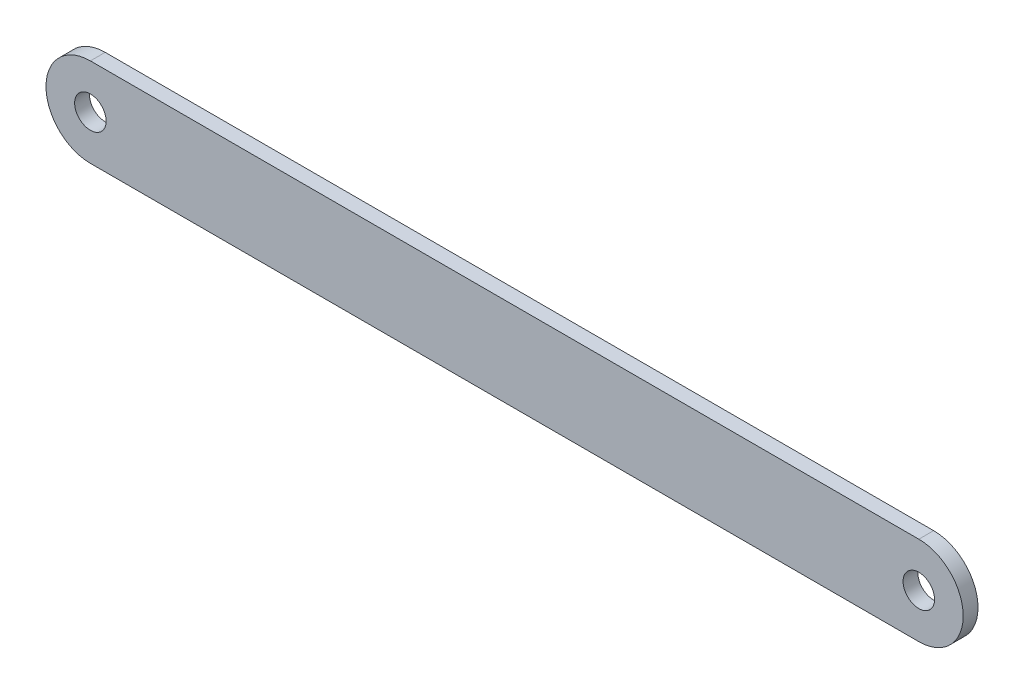
ISO-10303-21;
HEADER;
FILE_DESCRIPTION(('STEP AP214'),'2;1');
FILE_NAME('part.step','',(''),(''),'','','');
FILE_SCHEMA(('AUTOMOTIVE_DESIGN { 1 0 10303 214 1 1 1 1 }'));
ENDSEC;
DATA;
#1=APPLICATION_CONTEXT('core data for automotive mechanical design processes');
#2=APPLICATION_PROTOCOL_DEFINITION('international standard','automotive_design',2000,#1);
#3=PRODUCT_CONTEXT('',#1,'mechanical');
#4=PRODUCT('Part','Part','',(#3));
#5=PRODUCT_RELATED_PRODUCT_CATEGORY('part','',(#4));
#6=PRODUCT_DEFINITION_FORMATION('','',#4);
#7=PRODUCT_DEFINITION_CONTEXT('part definition',#1,'design');
#8=PRODUCT_DEFINITION('design','',#6,#7);
#9=PRODUCT_DEFINITION_SHAPE('','',#8);
#10=(LENGTH_UNIT() NAMED_UNIT(*) SI_UNIT(.MILLI.,.METRE.));
#11=(NAMED_UNIT(*) PLANE_ANGLE_UNIT() SI_UNIT($,.RADIAN.));
#12=(NAMED_UNIT(*) SI_UNIT($,.STERADIAN.) SOLID_ANGLE_UNIT());
#13=UNCERTAINTY_MEASURE_WITH_UNIT(LENGTH_MEASURE(1.E-05),#10,'distance_accuracy_value','');
#14=(GEOMETRIC_REPRESENTATION_CONTEXT(3) GLOBAL_UNCERTAINTY_ASSIGNED_CONTEXT((#13)) GLOBAL_UNIT_ASSIGNED_CONTEXT((#10,
#11,#12)) REPRESENTATION_CONTEXT('',''));
#15=CARTESIAN_POINT('',(0.,0.,0.));
#16=DIRECTION('',(0.,0.,1.));
#17=DIRECTION('',(1.,0.,0.));
#18=AXIS2_PLACEMENT_3D('',#15,#16,#17);
#19=CARTESIAN_POINT('',(88.9,0.,1.5875));
#20=DIRECTION('',(0.,0.,-1.));
#21=DIRECTION('',(-1.,0.,0.));
#22=AXIS2_PLACEMENT_3D('',#19,#20,#21);
#23=CYLINDRICAL_SURFACE('',#22,9.525);
#24=CARTESIAN_POINT('',(88.9,0.,-1.5875));
#25=DIRECTION('',(0.,0.,1.));
#26=DIRECTION('',(1.,0.,0.));
#27=AXIS2_PLACEMENT_3D('',#24,#25,#26);
#28=CIRCLE('',#27,9.525);
#29=CARTESIAN_POINT('',(88.9,-9.525,-1.5875));
#30=VERTEX_POINT('',#29);
#31=CARTESIAN_POINT('',(88.9,9.52500000000001,-1.5875));
#32=VERTEX_POINT('',#31);
#33=EDGE_CURVE('E98',#30,#32,#28,.T.);
#34=ORIENTED_EDGE('',*,*,#33,.T.);
#35=DIRECTION('',(0.,0.,-1.));
#36=VECTOR('',#35,1.);
#37=CARTESIAN_POINT('',(88.9,9.52500000000001,1.5875));
#38=LINE('',#37,#36);
#39=CARTESIAN_POINT('',(88.9,9.52500000000001,1.5875));
#40=VERTEX_POINT('',#39);
#41=EDGE_CURVE('E11',#40,#32,#38,.T.);
#42=ORIENTED_EDGE('',*,*,#41,.F.);
#43=CARTESIAN_POINT('',(88.9,0.,1.5875));
#44=DIRECTION('',(0.,0.,1.));
#45=DIRECTION('',(1.,0.,0.));
#46=AXIS2_PLACEMENT_3D('',#43,#44,#45);
#47=CIRCLE('',#46,9.525);
#48=CARTESIAN_POINT('',(88.9,-9.525,1.5875));
#49=VERTEX_POINT('',#48);
#50=EDGE_CURVE('E86',#49,#40,#47,.T.);
#51=ORIENTED_EDGE('',*,*,#50,.F.);
#52=DIRECTION('',(0.,0.,-1.));
#53=VECTOR('',#52,1.);
#54=CARTESIAN_POINT('',(88.9,-9.525,1.5875));
#55=LINE('',#54,#53);
#56=EDGE_CURVE('E94',#49,#30,#55,.T.);
#57=ORIENTED_EDGE('',*,*,#56,.T.);
#58=EDGE_LOOP('',(#34,#42,#51,#57));
#59=FACE_BOUND('',#58,.T.);
#60=ADVANCED_FACE('F35',(#59),#23,.T.);
#61=CARTESIAN_POINT('',(88.9,9.52500000000001,1.5875));
#62=DIRECTION('',(0.,-1.,0.));
#63=DIRECTION('',(1.,0.,0.));
#64=AXIS2_PLACEMENT_3D('',#61,#62,#63);
#65=PLANE('',#64);
#66=DIRECTION('',(-1.,0.,0.));
#67=VECTOR('',#66,1.);
#68=CARTESIAN_POINT('',(88.9,9.52500000000001,-1.5875));
#69=LINE('',#68,#67);
#70=CARTESIAN_POINT('',(-88.9,9.52499999999998,-1.5875));
#71=VERTEX_POINT('',#70);
#72=EDGE_CURVE('E90',#32,#71,#69,.T.);
#73=ORIENTED_EDGE('',*,*,#72,.T.);
#74=DIRECTION('',(0.,0.,-1.));
#75=VECTOR('',#74,1.);
#76=CARTESIAN_POINT('',(-88.9,9.52499999999998,1.5875));
#77=LINE('',#76,#75);
#78=CARTESIAN_POINT('',(-88.9,9.52499999999998,1.5875));
#79=VERTEX_POINT('',#78);
#80=EDGE_CURVE('E43',#79,#71,#77,.T.);
#81=ORIENTED_EDGE('',*,*,#80,.F.);
#82=DIRECTION('',(-1.,0.,0.));
#83=VECTOR('',#82,1.);
#84=CARTESIAN_POINT('',(88.9,9.52500000000001,1.5875));
#85=LINE('',#84,#83);
#86=EDGE_CURVE('E81',#40,#79,#85,.T.);
#87=ORIENTED_EDGE('',*,*,#86,.F.);
#88=ORIENTED_EDGE('',*,*,#41,.T.);
#89=EDGE_LOOP('',(#73,#81,#87,#88));
#90=FACE_BOUND('',#89,.T.);
#91=ADVANCED_FACE('F89',(#90),#65,.F.);
#92=CARTESIAN_POINT('',(-88.9,0.,1.5875));
#93=DIRECTION('',(0.,0.,-1.));
#94=DIRECTION('',(-1.,0.,0.));
#95=AXIS2_PLACEMENT_3D('',#92,#93,#94);
#96=CYLINDRICAL_SURFACE('',#95,9.525);
#97=CARTESIAN_POINT('',(-88.9,0.,-1.5875));
#98=DIRECTION('',(0.,0.,1.));
#99=DIRECTION('',(1.,0.,0.));
#100=AXIS2_PLACEMENT_3D('',#97,#98,#99);
#101=CIRCLE('',#100,9.525);
#102=CARTESIAN_POINT('',(-88.9,-9.52500000000002,-1.5875));
#103=VERTEX_POINT('',#102);
#104=EDGE_CURVE('E68',#71,#103,#101,.T.);
#105=ORIENTED_EDGE('',*,*,#104,.T.);
#106=DIRECTION('',(0.,0.,-1.));
#107=VECTOR('',#106,1.);
#108=CARTESIAN_POINT('',(-88.9,-9.52500000000002,1.5875));
#109=LINE('',#108,#107);
#110=CARTESIAN_POINT('',(-88.9,-9.52500000000002,1.5875));
#111=VERTEX_POINT('',#110);
#112=EDGE_CURVE('E91',#111,#103,#109,.T.);
#113=ORIENTED_EDGE('',*,*,#112,.F.);
#114=CARTESIAN_POINT('',(-88.9,0.,1.5875));
#115=DIRECTION('',(0.,0.,1.));
#116=DIRECTION('',(1.,0.,0.));
#117=AXIS2_PLACEMENT_3D('',#114,#115,#116);
#118=CIRCLE('',#117,9.525);
#119=EDGE_CURVE('E84',#79,#111,#118,.T.);
#120=ORIENTED_EDGE('',*,*,#119,.F.);
#121=ORIENTED_EDGE('',*,*,#80,.T.);
#122=EDGE_LOOP('',(#105,#113,#120,#121));
#123=FACE_BOUND('',#122,.T.);
#124=ADVANCED_FACE('F92',(#123),#96,.T.);
#125=CARTESIAN_POINT('',(88.9,-9.525,1.5875));
#126=DIRECTION('',(0.,1.,0.));
#127=DIRECTION('',(-1.,0.,0.));
#128=AXIS2_PLACEMENT_3D('',#125,#126,#127);
#129=PLANE('',#128);
#130=DIRECTION('',(1.,0.,0.));
#131=VECTOR('',#130,1.);
#132=CARTESIAN_POINT('',(88.9,-9.525,-1.5875));
#133=LINE('',#132,#131);
#134=EDGE_CURVE('E74',#103,#30,#133,.T.);
#135=ORIENTED_EDGE('',*,*,#134,.T.);
#136=ORIENTED_EDGE('',*,*,#56,.F.);
#137=DIRECTION('',(1.,0.,0.));
#138=VECTOR('',#137,1.);
#139=CARTESIAN_POINT('',(88.9,-9.525,1.5875));
#140=LINE('',#139,#138);
#141=EDGE_CURVE('E51',#111,#49,#140,.T.);
#142=ORIENTED_EDGE('',*,*,#141,.F.);
#143=ORIENTED_EDGE('',*,*,#112,.T.);
#144=EDGE_LOOP('',(#135,#136,#142,#143));
#145=FACE_BOUND('',#144,.T.);
#146=ADVANCED_FACE('F106',(#145),#129,.F.);
#147=CARTESIAN_POINT('',(88.9,0.,1.5875));
#148=DIRECTION('',(0.,0.,1.));
#149=DIRECTION('',(1.,0.,0.));
#150=AXIS2_PLACEMENT_3D('',#147,#148,#149);
#151=PLANE('',#150);
#152=CARTESIAN_POINT('',(-88.9,0.,1.5875));
#153=DIRECTION('',(0.,0.,1.));
#154=DIRECTION('',(1.,0.,0.));
#155=AXIS2_PLACEMENT_3D('',#152,#153,#154);
#156=CIRCLE('',#155,3.37819999999998);
#157=CARTESIAN_POINT('',(-85.5218,0.,1.5875));
#158=VERTEX_POINT('',#157);
#159=EDGE_CURVE('E120',#158,#158,#156,.T.);
#160=ORIENTED_EDGE('',*,*,#159,.F.);
#161=EDGE_LOOP('',(#160));
#162=FACE_BOUND('',#161,.T.);
#163=CARTESIAN_POINT('',(88.9,0.,1.5875));
#164=DIRECTION('',(0.,0.,1.));
#165=DIRECTION('',(1.,0.,0.));
#166=AXIS2_PLACEMENT_3D('',#163,#164,#165);
#167=CIRCLE('',#166,3.37819999999998);
#168=CARTESIAN_POINT('',(92.2782,0.,1.5875));
#169=VERTEX_POINT('',#168);
#170=EDGE_CURVE('E114',#169,#169,#167,.T.);
#171=ORIENTED_EDGE('',*,*,#170,.F.);
#172=EDGE_LOOP('',(#171));
#173=FACE_BOUND('',#172,.T.);
#174=ORIENTED_EDGE('',*,*,#50,.T.);
#175=ORIENTED_EDGE('',*,*,#86,.T.);
#176=ORIENTED_EDGE('',*,*,#119,.T.);
#177=ORIENTED_EDGE('',*,*,#141,.T.);
#178=EDGE_LOOP('',(#174,#175,#176,#177));
#179=FACE_BOUND('',#178,.T.);
#180=ADVANCED_FACE('F82',(#162,#173,#179),#151,.T.);
#181=CARTESIAN_POINT('',(88.9,0.,-1.5875));
#182=DIRECTION('',(0.,0.,1.));
#183=DIRECTION('',(1.,0.,0.));
#184=AXIS2_PLACEMENT_3D('',#181,#182,#183);
#185=PLANE('',#184);
#186=CARTESIAN_POINT('',(-88.9,0.,-1.5875));
#187=DIRECTION('',(0.,0.,1.));
#188=DIRECTION('',(1.,0.,0.));
#189=AXIS2_PLACEMENT_3D('',#186,#187,#188);
#190=CIRCLE('',#189,3.3782);
#191=CARTESIAN_POINT('',(-85.5218,0.,-1.5875));
#192=VERTEX_POINT('',#191);
#193=EDGE_CURVE('E117',#192,#192,#190,.T.);
#194=ORIENTED_EDGE('',*,*,#193,.T.);
#195=EDGE_LOOP('',(#194));
#196=FACE_BOUND('',#195,.T.);
#197=CARTESIAN_POINT('',(88.9,0.,-1.5875));
#198=DIRECTION('',(0.,0.,1.));
#199=DIRECTION('',(1.,0.,0.));
#200=AXIS2_PLACEMENT_3D('',#197,#198,#199);
#201=CIRCLE('',#200,3.3782);
#202=CARTESIAN_POINT('',(92.2782,0.,-1.5875));
#203=VERTEX_POINT('',#202);
#204=EDGE_CURVE('E101',#203,#203,#201,.T.);
#205=ORIENTED_EDGE('',*,*,#204,.T.);
#206=EDGE_LOOP('',(#205));
#207=FACE_BOUND('',#206,.T.);
#208=ORIENTED_EDGE('',*,*,#33,.F.);
#209=ORIENTED_EDGE('',*,*,#134,.F.);
#210=ORIENTED_EDGE('',*,*,#104,.F.);
#211=ORIENTED_EDGE('',*,*,#72,.F.);
#212=EDGE_LOOP('',(#208,#209,#210,#211));
#213=FACE_BOUND('',#212,.T.);
#214=ADVANCED_FACE('F109',(#196,#207,#213),#185,.F.);
#215=CARTESIAN_POINT('',(88.9,0.,1.5875));
#216=DIRECTION('',(0.,0.,1.));
#217=DIRECTION('',(1.,0.,0.));
#218=AXIS2_PLACEMENT_3D('',#215,#216,#217);
#219=CYLINDRICAL_SURFACE('',#218,3.37819999999999);
#220=ORIENTED_EDGE('',*,*,#204,.F.);
#221=EDGE_LOOP('',(#220));
#222=FACE_BOUND('',#221,.T.);
#223=ORIENTED_EDGE('',*,*,#170,.T.);
#224=EDGE_LOOP('',(#223));
#225=FACE_BOUND('',#224,.T.);
#226=ADVANCED_FACE('F131',(#222,#225),#219,.F.);
#227=CARTESIAN_POINT('',(-88.9,0.,1.5875));
#228=DIRECTION('',(0.,0.,1.));
#229=DIRECTION('',(1.,0.,0.));
#230=AXIS2_PLACEMENT_3D('',#227,#228,#229);
#231=CYLINDRICAL_SURFACE('',#230,3.37819999999999);
#232=ORIENTED_EDGE('',*,*,#193,.F.);
#233=EDGE_LOOP('',(#232));
#234=FACE_BOUND('',#233,.T.);
#235=ORIENTED_EDGE('',*,*,#159,.T.);
#236=EDGE_LOOP('',(#235));
#237=FACE_BOUND('',#236,.T.);
#238=ADVANCED_FACE('F124',(#234,#237),#231,.F.);
#239=CLOSED_SHELL('',(#60,#91,#124,#146,#180,#214,#226,#238));
#240=MANIFOLD_SOLID_BREP('B2',#239);
#241=ADVANCED_BREP_SHAPE_REPRESENTATION('',(#18,#240),#14);
#242=SHAPE_DEFINITION_REPRESENTATION(#9,#241);
ENDSEC;
END-ISO-10303-21;
